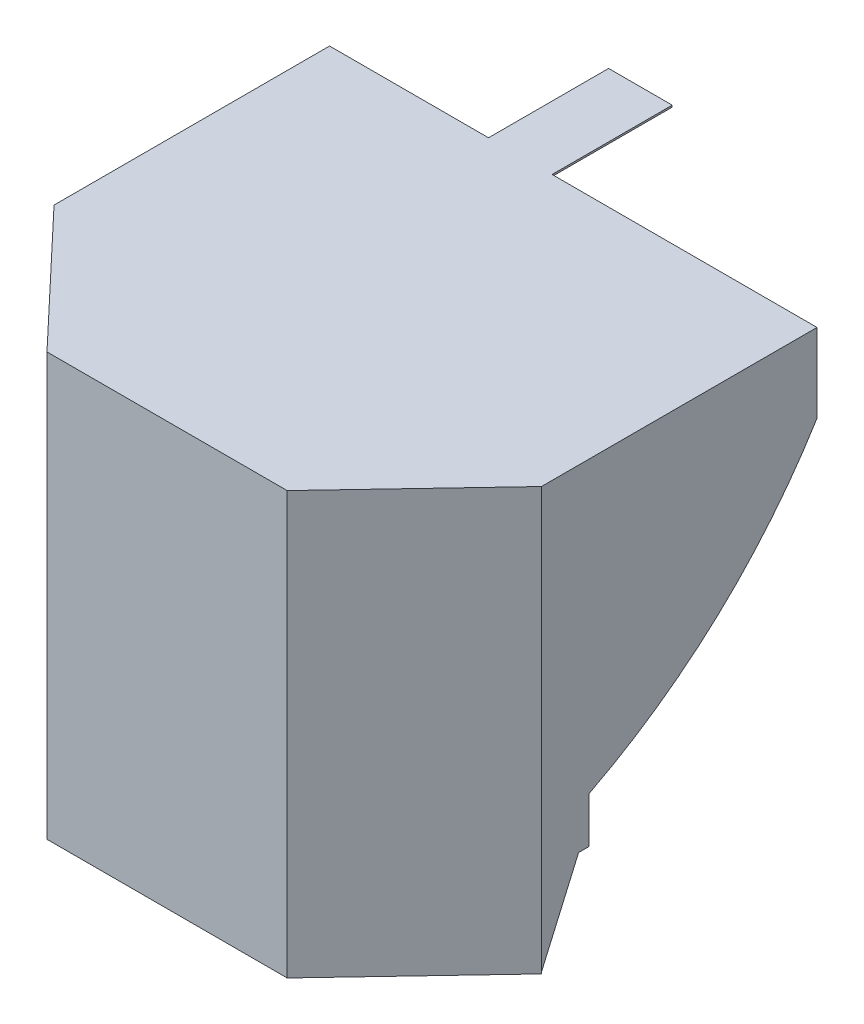
ISO-10303-21;
HEADER;
FILE_DESCRIPTION(('STEP AP214'),'2;1');
FILE_NAME('part.step','',(''),(''),'','','');
FILE_SCHEMA(('AUTOMOTIVE_DESIGN { 1 0 10303 214 1 1 1 1 }'));
ENDSEC;
DATA;
#1=APPLICATION_CONTEXT('core data for automotive mechanical design processes');
#2=APPLICATION_PROTOCOL_DEFINITION('international standard','automotive_design',2000,#1);
#3=PRODUCT_CONTEXT('',#1,'mechanical');
#4=PRODUCT('Part','Part','',(#3));
#5=PRODUCT_RELATED_PRODUCT_CATEGORY('part','',(#4));
#6=PRODUCT_DEFINITION_FORMATION('','',#4);
#7=PRODUCT_DEFINITION_CONTEXT('part definition',#1,'design');
#8=PRODUCT_DEFINITION('design','',#6,#7);
#9=PRODUCT_DEFINITION_SHAPE('','',#8);
#10=(LENGTH_UNIT() NAMED_UNIT(*) SI_UNIT(.MILLI.,.METRE.));
#11=(NAMED_UNIT(*) PLANE_ANGLE_UNIT() SI_UNIT($,.RADIAN.));
#12=(NAMED_UNIT(*) SI_UNIT($,.STERADIAN.) SOLID_ANGLE_UNIT());
#13=UNCERTAINTY_MEASURE_WITH_UNIT(LENGTH_MEASURE(1.E-05),#10,'distance_accuracy_value','');
#14=(GEOMETRIC_REPRESENTATION_CONTEXT(3) GLOBAL_UNCERTAINTY_ASSIGNED_CONTEXT((#13)) GLOBAL_UNIT_ASSIGNED_CONTEXT((#10,
#11,#12)) REPRESENTATION_CONTEXT('',''));
#15=CARTESIAN_POINT('',(0.,0.,0.));
#16=DIRECTION('',(0.,0.,1.));
#17=DIRECTION('',(1.,0.,0.));
#18=AXIS2_PLACEMENT_3D('',#15,#16,#17);
#19=CARTESIAN_POINT('',(276.,0.,-124.922861264772));
#20=DIRECTION('',(0.726468416954703,0.,0.687199853876096));
#21=DIRECTION('',(0.687199853876096,0.,-0.726468416954703));
#22=AXIS2_PLACEMENT_3D('',#19,#20,#21);
#23=PLANE('',#22);
#24=DIRECTION('',(0.,-1.,0.));
#25=VECTOR('',#24,1.);
#26=CARTESIAN_POINT('',(135.999999999882,0.,23.0771387348958));
#27=LINE('',#26,#25);
#28=CARTESIAN_POINT('',(135.999999999659,476.,23.077138734685));
#29=VERTEX_POINT('',#28);
#30=CARTESIAN_POINT('',(135.999999999882,-2.,23.0771387348958));
#31=VERTEX_POINT('',#30);
#32=EDGE_CURVE('E481',#29,#31,#27,.T.);
#33=ORIENTED_EDGE('',*,*,#32,.T.);
#34=DIRECTION('',(-0.687199853877257,0.,0.726468416953605));
#35=VECTOR('',#34,1.);
#36=CARTESIAN_POINT('',(135.999999999882,-2.,23.0771387348958));
#37=LINE('',#36,#35);
#38=CARTESIAN_POINT('',(276.000000000422,-2.,-124.922861265196));
#39=VERTEX_POINT('',#38);
#40=EDGE_CURVE('E451',#39,#31,#37,.T.);
#41=ORIENTED_EDGE('',*,*,#40,.F.);
#42=DIRECTION('',(0.,-1.,0.));
#43=VECTOR('',#42,1.);
#44=CARTESIAN_POINT('',(276.000000000422,0.,-124.922861265196));
#45=LINE('',#44,#43);
#46=CARTESIAN_POINT('',(276.000000000422,9.69753366541467E-10,-124.922861265196));
#47=VERTEX_POINT('',#46);
#48=EDGE_CURVE('E473',#47,#39,#45,.T.);
#49=ORIENTED_EDGE('',*,*,#48,.F.);
#50=CARTESIAN_POINT('',(276.,476.,-124.922861265196));
#51=VERTEX_POINT('',#50);
#52=EDGE_CURVE('E469',#51,#47,#45,.T.);
#53=ORIENTED_EDGE('',*,*,#52,.F.);
#54=DIRECTION('',(0.687199853877258,0.,-0.726468416953605));
#55=VECTOR('',#54,1.);
#56=CARTESIAN_POINT('',(276.,476.,-124.922861265196));
#57=LINE('',#56,#55);
#58=EDGE_CURVE('E262',#29,#51,#57,.T.);
#59=ORIENTED_EDGE('',*,*,#58,.F.);
#60=EDGE_LOOP('',(#33,#41,#49,#53,#59));
#61=FACE_BOUND('',#60,.T.);
#62=ADVANCED_FACE('F17',(#61),#23,.T.);
#63=CARTESIAN_POINT('',(-136.002670109606,0.,23.0771387348958));
#64=DIRECTION('',(-0.726468416953688,0.,0.687199853877169));
#65=DIRECTION('',(0.687199853877169,0.,0.726468416953688));
#66=AXIS2_PLACEMENT_3D('',#63,#64,#65);
#67=PLANE('',#66);
#68=DIRECTION('',(0.,-1.,0.));
#69=VECTOR('',#68,1.);
#70=CARTESIAN_POINT('',(-276.002670109606,0.,-124.922861264661));
#71=LINE('',#70,#69);
#72=CARTESIAN_POINT('',(-276.002670109721,476.,-124.922861264783));
#73=VERTEX_POINT('',#72);
#74=CARTESIAN_POINT('',(-276.002670109606,-2.,-124.922861264661));
#75=VERTEX_POINT('',#74);
#76=EDGE_CURVE('E237',#73,#75,#71,.T.);
#77=ORIENTED_EDGE('',*,*,#76,.T.);
#78=DIRECTION('',(-0.687199853877169,0.,-0.726468416953688));
#79=VECTOR('',#78,1.);
#80=CARTESIAN_POINT('',(-136.002670109606,-2.,23.0771387348958));
#81=LINE('',#80,#79);
#82=CARTESIAN_POINT('',(-136.002670109606,-2.,23.0771387348958));
#83=VERTEX_POINT('',#82);
#84=EDGE_CURVE('E464',#83,#75,#81,.T.);
#85=ORIENTED_EDGE('',*,*,#84,.F.);
#86=DIRECTION('',(0.,-1.,0.));
#87=VECTOR('',#86,1.);
#88=CARTESIAN_POINT('',(-136.002670109606,0.,23.0771387348958));
#89=LINE('',#88,#87);
#90=CARTESIAN_POINT('',(-136.002670109605,476.,23.077138734685));
#91=VERTEX_POINT('',#90);
#92=EDGE_CURVE('E239',#91,#83,#89,.T.);
#93=ORIENTED_EDGE('',*,*,#92,.F.);
#94=DIRECTION('',(0.687199853877685,0.,0.7264684169532));
#95=VECTOR('',#94,1.);
#96=CARTESIAN_POINT('',(-276.,476.,-124.920038577364));
#97=LINE('',#96,#95);
#98=EDGE_CURVE('E233',#73,#91,#97,.T.);
#99=ORIENTED_EDGE('',*,*,#98,.F.);
#100=EDGE_LOOP('',(#77,#85,#93,#99));
#101=FACE_BOUND('',#100,.T.);
#102=ADVANCED_FACE('F235',(#101),#67,.T.);
#103=CARTESIAN_POINT('',(-4.96942283656245,-2.,-303.536896852607));
#104=DIRECTION('',(0.,1.,0.));
#105=DIRECTION('',(0.,0.,1.));
#106=AXIS2_PLACEMENT_3D('',#103,#104,#105);
#107=PLANE('',#106);
#108=ORIENTED_EDGE('',*,*,#40,.T.);
#109=DIRECTION('',(-1.,0.,0.));
#110=VECTOR('',#109,1.);
#111=CARTESIAN_POINT('',(135.999999999882,-2.,23.0771387348958));
#112=LINE('',#111,#110);
#113=EDGE_CURVE('E455',#31,#83,#112,.T.);
#114=ORIENTED_EDGE('',*,*,#113,.T.);
#115=ORIENTED_EDGE('',*,*,#84,.T.);
#116=DIRECTION('',(1.,0.,0.));
#117=VECTOR('',#116,1.);
#118=CARTESIAN_POINT('',(-276.002670109606,-2.,-124.922861264661));
#119=LINE('',#118,#117);
#120=CARTESIAN_POINT('',(-246.002670109606,-2.,-124.922861264661));
#121=VERTEX_POINT('',#120);
#122=EDGE_CURVE('E254',#75,#121,#119,.T.);
#123=ORIENTED_EDGE('',*,*,#122,.T.);
#124=CARTESIAN_POINT('',(-4.96942283656245,-2.,-303.536896852607));
#125=DIRECTION('',(0.,1.,0.));
#126=DIRECTION('',(1.,0.,0.));
#127=AXIS2_PLACEMENT_3D('',#124,#125,#126);
#128=CIRCLE('',#127,300.);
#129=CARTESIAN_POINT('',(-150.000000000121,-2.,-40.9228612650071));
#130=VERTEX_POINT('',#129);
#131=EDGE_CURVE('E696',#121,#130,#128,.T.);
#132=ORIENTED_EDGE('',*,*,#131,.T.);
#133=DIRECTION('',(1.,0.,0.));
#134=VECTOR('',#133,1.);
#135=CARTESIAN_POINT('',(-150.000000000121,-2.,-40.9228612650071));
#136=LINE('',#135,#134);
#137=CARTESIAN_POINT('',(149.999999999317,-2.,-40.9228612650071));
#138=VERTEX_POINT('',#137);
#139=EDGE_CURVE('E700',#130,#138,#136,.T.);
#140=ORIENTED_EDGE('',*,*,#139,.T.);
#141=CARTESIAN_POINT('',(4.96490300414403,-2.,-303.53440069083));
#142=DIRECTION('',(0.,1.,0.));
#143=DIRECTION('',(1.,0.,0.));
#144=AXIS2_PLACEMENT_3D('',#141,#142,#143);
#145=CIRCLE('',#144,300.);
#146=CARTESIAN_POINT('',(246.000000000421,-2.,-124.922861265196));
#147=VERTEX_POINT('',#146);
#148=EDGE_CURVE('E703',#138,#147,#145,.T.);
#149=ORIENTED_EDGE('',*,*,#148,.T.);
#150=DIRECTION('',(1.,0.,0.));
#151=VECTOR('',#150,1.);
#152=CARTESIAN_POINT('',(246.000000000421,-2.,-124.922861265196));
#153=LINE('',#152,#151);
#154=EDGE_CURVE('E273',#147,#39,#153,.T.);
#155=ORIENTED_EDGE('',*,*,#154,.T.);
#156=EDGE_LOOP('',(#108,#114,#115,#123,#132,#140,#149,#155));
#157=FACE_BOUND('',#156,.T.);
#158=ADVANCED_FACE('F562',(#157),#107,.F.);
#159=CARTESIAN_POINT('',(-276.,0.,-436.922861264772));
#160=DIRECTION('',(0.,0.,1.));
#161=DIRECTION('',(0.,1.,0.));
#162=AXIS2_PLACEMENT_3D('',#159,#160,#161);
#163=PLANE('',#162);
#164=DIRECTION('',(1.,0.,0.));
#165=VECTOR('',#164,1.);
#166=CARTESIAN_POINT('',(-876.,387.,-436.922861264772));
#167=LINE('',#166,#165);
#168=CARTESIAN_POINT('',(-276.,387.,-436.922861264772));
#169=VERTEX_POINT('',#168);
#170=CARTESIAN_POINT('',(-274.,387.,-436.922861264772));
#171=VERTEX_POINT('',#170);
#172=EDGE_CURVE('E637',#169,#171,#167,.T.);
#173=ORIENTED_EDGE('',*,*,#172,.F.);
#174=DIRECTION('',(0.,1.,0.));
#175=VECTOR('',#174,1.);
#176=CARTESIAN_POINT('',(-276.,0.,-436.922861264772));
#177=LINE('',#176,#175);
#178=CARTESIAN_POINT('',(-276.,476.,-436.922861264772));
#179=VERTEX_POINT('',#178);
#180=EDGE_CURVE('E376',#169,#179,#177,.T.);
#181=ORIENTED_EDGE('',*,*,#180,.T.);
#182=DIRECTION('',(-1.,0.,0.));
#183=VECTOR('',#182,1.);
#184=CARTESIAN_POINT('',(-276.,476.,-436.922861264772));
#185=LINE('',#184,#183);
#186=CARTESIAN_POINT('',(-96.,476.,-436.922861264772));
#187=VERTEX_POINT('',#186);
#188=EDGE_CURVE('E437',#187,#179,#185,.T.);
#189=ORIENTED_EDGE('',*,*,#188,.F.);
#190=DIRECTION('',(0.,1.,0.));
#191=VECTOR('',#190,1.);
#192=CARTESIAN_POINT('',(-96.,474.,-436.922861264772));
#193=LINE('',#192,#191);
#194=CARTESIAN_POINT('',(-96.,474.,-436.922861264772));
#195=VERTEX_POINT('',#194);
#196=EDGE_CURVE('E401',#195,#187,#193,.T.);
#197=ORIENTED_EDGE('',*,*,#196,.F.);
#198=DIRECTION('',(-1.,0.,0.));
#199=VECTOR('',#198,1.);
#200=CARTESIAN_POINT('',(-276.,474.,-436.922861264772));
#201=LINE('',#200,#199);
#202=CARTESIAN_POINT('',(-274.,474.,-436.922861264772));
#203=VERTEX_POINT('',#202);
#204=EDGE_CURVE('E397',#195,#203,#201,.T.);
#205=ORIENTED_EDGE('',*,*,#204,.T.);
#206=DIRECTION('',(0.,1.,0.));
#207=VECTOR('',#206,1.);
#208=CARTESIAN_POINT('',(-274.,0.,-436.922861264772));
#209=LINE('',#208,#207);
#210=EDGE_CURVE('E338',#171,#203,#209,.T.);
#211=ORIENTED_EDGE('',*,*,#210,.F.);
#212=EDGE_LOOP('',(#173,#181,#189,#197,#205,#211));
#213=FACE_BOUND('',#212,.T.);
#214=ADVANCED_FACE('F399',(#213),#163,.F.);
#215=CARTESIAN_POINT('',(276.,0.,-436.922861264771));
#216=DIRECTION('',(0.,0.,-1.));
#217=DIRECTION('',(0.,1.,0.));
#218=AXIS2_PLACEMENT_3D('',#215,#216,#217);
#219=PLANE('',#218);
#220=CARTESIAN_POINT('',(274.,387.,-436.922861264771));
#221=VERTEX_POINT('',#220);
#222=CARTESIAN_POINT('',(276.,387.,-436.922861264771));
#223=VERTEX_POINT('',#222);
#224=EDGE_CURVE('E499',#221,#223,#167,.T.);
#225=ORIENTED_EDGE('',*,*,#224,.F.);
#226=DIRECTION('',(0.,1.,0.));
#227=VECTOR('',#226,1.);
#228=CARTESIAN_POINT('',(274.,0.,-436.922861264771));
#229=LINE('',#228,#227);
#230=CARTESIAN_POINT('',(274.,474.,-436.922861264771));
#231=VERTEX_POINT('',#230);
#232=EDGE_CURVE('E357',#221,#231,#229,.T.);
#233=ORIENTED_EDGE('',*,*,#232,.T.);
#234=DIRECTION('',(-1.,0.,0.));
#235=VECTOR('',#234,1.);
#236=CARTESIAN_POINT('',(-24.0000000000053,474.,-436.922861264772));
#237=LINE('',#236,#235);
#238=CARTESIAN_POINT('',(-24.0000000000053,474.,-436.922861264772));
#239=VERTEX_POINT('',#238);
#240=EDGE_CURVE('E413',#231,#239,#237,.T.);
#241=ORIENTED_EDGE('',*,*,#240,.T.);
#242=DIRECTION('',(0.,1.,0.));
#243=VECTOR('',#242,1.);
#244=CARTESIAN_POINT('',(-24.0000000000053,474.,-436.922861264772));
#245=LINE('',#244,#243);
#246=CARTESIAN_POINT('',(-24.0000000000053,476.,-436.922861264772));
#247=VERTEX_POINT('',#246);
#248=EDGE_CURVE('E411',#239,#247,#245,.T.);
#249=ORIENTED_EDGE('',*,*,#248,.T.);
#250=DIRECTION('',(-1.,0.,0.));
#251=VECTOR('',#250,1.);
#252=CARTESIAN_POINT('',(-24.0000000000053,476.,-436.922861264772));
#253=LINE('',#252,#251);
#254=CARTESIAN_POINT('',(276.,476.,-436.922861264772));
#255=VERTEX_POINT('',#254);
#256=EDGE_CURVE('E421',#255,#247,#253,.T.);
#257=ORIENTED_EDGE('',*,*,#256,.F.);
#258=DIRECTION('',(0.,1.,0.));
#259=VECTOR('',#258,1.);
#260=CARTESIAN_POINT('',(276.,0.,-436.922861264771));
#261=LINE('',#260,#259);
#262=EDGE_CURVE('E343',#223,#255,#261,.T.);
#263=ORIENTED_EDGE('',*,*,#262,.F.);
#264=EDGE_LOOP('',(#225,#233,#241,#249,#257,#263));
#265=FACE_BOUND('',#264,.T.);
#266=ADVANCED_FACE('F19',(#265),#219,.T.);
#267=CARTESIAN_POINT('',(274.,0.,-124.922861264772));
#268=DIRECTION('',(1.,0.,0.));
#269=DIRECTION('',(0.,0.,-1.));
#270=AXIS2_PLACEMENT_3D('',#267,#268,#269);
#271=PLANE('',#270);
#272=DIRECTION('',(0.,0.,-1.));
#273=VECTOR('',#272,1.);
#274=CARTESIAN_POINT('',(274.,474.,-124.922861264772));
#275=LINE('',#274,#273);
#276=CARTESIAN_POINT('',(274.,474.,-125.719733129875));
#277=VERTEX_POINT('',#276);
#278=EDGE_CURVE('E361',#277,#231,#275,.T.);
#279=ORIENTED_EDGE('',*,*,#278,.T.);
#280=ORIENTED_EDGE('',*,*,#232,.F.);
#281=CARTESIAN_POINT('',(274.,726.561368596782,117.331662358338));
#282=DIRECTION('',(1.,0.,0.));
#283=DIRECTION('',(0.,0.,-1.));
#284=AXIS2_PLACEMENT_3D('',#281,#282,#283);
#285=CIRCLE('',#284,650.);
#286=CARTESIAN_POINT('',(274.,148.,-178.922861265215));
#287=VERTEX_POINT('',#286);
#288=EDGE_CURVE('E378',#221,#287,#285,.F.);
#289=ORIENTED_EDGE('',*,*,#288,.T.);
#290=DIRECTION('',(0.,-1.,0.));
#291=VECTOR('',#290,1.);
#292=CARTESIAN_POINT('',(274.,0.,-178.922861265215));
#293=LINE('',#292,#291);
#294=CARTESIAN_POINT('',(274.,96.,-178.922861265215));
#295=VERTEX_POINT('',#294);
#296=EDGE_CURVE('E610',#287,#295,#293,.T.);
#297=ORIENTED_EDGE('',*,*,#296,.T.);
#298=DIRECTION('',(0.,0.,1.));
#299=VECTOR('',#298,1.);
#300=CARTESIAN_POINT('',(274.,96.,-124.922861264772));
#301=LINE('',#300,#299);
#302=CARTESIAN_POINT('',(274.,96.,-166.922861265215));
#303=VERTEX_POINT('',#302);
#304=EDGE_CURVE('E619',#295,#303,#301,.T.);
#305=ORIENTED_EDGE('',*,*,#304,.T.);
#306=DIRECTION('',(0.,-0.916157334900635,0.40081883402326));
#307=VECTOR('',#306,1.);
#308=CARTESIAN_POINT('',(274.,0.,-124.922861264772));
#309=LINE('',#308,#307);
#310=CARTESIAN_POINT('',(274.,1.82142140593046,-125.719733129875));
#311=VERTEX_POINT('',#310);
#312=EDGE_CURVE('E506',#303,#311,#309,.T.);
#313=ORIENTED_EDGE('',*,*,#312,.T.);
#314=DIRECTION('',(0.,1.,0.));
#315=VECTOR('',#314,1.);
#316=CARTESIAN_POINT('',(274.,0.,-125.719733129875));
#317=LINE('',#316,#315);
#318=EDGE_CURVE('E327',#311,#277,#317,.T.);
#319=ORIENTED_EDGE('',*,*,#318,.T.);
#320=EDGE_LOOP('',(#279,#280,#289,#297,#305,#313,#319));
#321=FACE_BOUND('',#320,.T.);
#322=ADVANCED_FACE('F502',(#321),#271,.F.);
#323=CARTESIAN_POINT('',(273.998,0.,-125.719733129875));
#324=DIRECTION('',(0.,1.,0.));
#325=DIRECTION('',(0.,0.,1.));
#326=AXIS2_PLACEMENT_3D('',#323,#324,#325);
#327=CYLINDRICAL_SURFACE('',#326,0.00199999999999983);
#328=ORIENTED_EDGE('',*,*,#318,.F.);
#329=CARTESIAN_POINT('',(273.998,1.82142140593046,-125.719733129875));
#330=DIRECTION('',(0.,0.40081883402326,0.916157334900635));
#331=DIRECTION('',(0.,0.916157334900635,-0.40081883402326));
#332=AXIS2_PLACEMENT_3D('',#329,#330,#331);
#333=ELLIPSE('',#332,0.00498978548469049,0.00199999999999983);
#334=CARTESIAN_POINT('',(273.999452936834,1.81827992088415,-125.718358730167));
#335=VERTEX_POINT('',#334);
#336=EDGE_CURVE('E627',#311,#335,#333,.F.);
#337=ORIENTED_EDGE('',*,*,#336,.T.);
#338=DIRECTION('',(0.,1.,0.));
#339=VECTOR('',#338,1.);
#340=CARTESIAN_POINT('',(273.999452936834,0.,-125.718358730167));
#341=LINE('',#340,#339);
#342=CARTESIAN_POINT('',(273.999452936834,474.,-125.718358730167));
#343=VERTEX_POINT('',#342);
#344=EDGE_CURVE('E328',#335,#343,#341,.T.);
#345=ORIENTED_EDGE('',*,*,#344,.T.);
#346=CARTESIAN_POINT('',(273.998,474.,-125.719733129875));
#347=DIRECTION('',(0.,1.,0.));
#348=DIRECTION('',(0.,0.,1.));
#349=AXIS2_PLACEMENT_3D('',#346,#347,#348);
#350=CIRCLE('',#349,0.00199999999999983);
#351=EDGE_CURVE('E323',#343,#277,#350,.T.);
#352=ORIENTED_EDGE('',*,*,#351,.T.);
#353=EDGE_LOOP('',(#328,#337,#345,#352));
#354=FACE_BOUND('',#353,.T.);
#355=ADVANCED_FACE('F512',(#354),#327,.F.);
#356=CARTESIAN_POINT('',(274.547063166091,0.,-126.297260972524));
#357=DIRECTION('',(0.726468416954703,0.,0.687199853876096));
#358=DIRECTION('',(0.687199853876096,0.,-0.726468416954703));
#359=AXIS2_PLACEMENT_3D('',#356,#357,#358);
#360=PLANE('',#359);
#361=DIRECTION('',(-0.354525571380812,-0.856649543898845,0.374784175459702));
#362=VECTOR('',#361,1.);
#363=CARTESIAN_POINT('',(273.592981060616,0.836111142441613,-125.288659889594));
#364=LINE('',#363,#362);
#365=CARTESIAN_POINT('',(273.246955334835,0.,-124.922861265196));
#366=VERTEX_POINT('',#365);
#367=EDGE_CURVE('E370',#335,#366,#364,.T.);
#368=ORIENTED_EDGE('',*,*,#367,.T.);
#369=DIRECTION('',(0.687199853876096,0.,-0.726468416954703));
#370=VECTOR('',#369,1.);
#371=CARTESIAN_POINT('',(274.547063166091,0.,-126.297260972524));
#372=LINE('',#371,#370);
#373=CARTESIAN_POINT('',(135.13943901038,0.,21.0765131349361));
#374=VERTEX_POINT('',#373);
#375=EDGE_CURVE('E332',#374,#366,#372,.T.);
#376=ORIENTED_EDGE('',*,*,#375,.F.);
#377=DIRECTION('',(0.,1.,0.));
#378=VECTOR('',#377,1.);
#379=CARTESIAN_POINT('',(135.13943901038,0.,21.0765131349361));
#380=LINE('',#379,#378);
#381=CARTESIAN_POINT('',(135.13943901038,474.,21.0765131349361));
#382=VERTEX_POINT('',#381);
#383=EDGE_CURVE('E333',#374,#382,#380,.T.);
#384=ORIENTED_EDGE('',*,*,#383,.T.);
#385=DIRECTION('',(0.687199853876096,0.,-0.726468416954703));
#386=VECTOR('',#385,1.);
#387=CARTESIAN_POINT('',(274.547063166091,474.,-126.297260972524));
#388=LINE('',#387,#386);
#389=EDGE_CURVE('E329',#382,#343,#388,.T.);
#390=ORIENTED_EDGE('',*,*,#389,.T.);
#391=ORIENTED_EDGE('',*,*,#344,.F.);
#392=EDGE_LOOP('',(#368,#376,#384,#390,#391));
#393=FACE_BOUND('',#392,.T.);
#394=ADVANCED_FACE('F520',(#393),#360,.F.);
#395=CARTESIAN_POINT('',(135.137986073546,0.,21.0751387352284));
#396=DIRECTION('',(0.,1.,0.));
#397=DIRECTION('',(0.,0.,1.));
#398=AXIS2_PLACEMENT_3D('',#395,#396,#397);
#399=CYLINDRICAL_SURFACE('',#398,0.00199999999999983);
#400=CARTESIAN_POINT('',(135.137986073546,474.,21.0751387352284));
#401=DIRECTION('',(0.,1.,0.));
#402=DIRECTION('',(0.,0.,1.));
#403=AXIS2_PLACEMENT_3D('',#400,#401,#402);
#404=CIRCLE('',#403,0.00199999999999983);
#405=CARTESIAN_POINT('',(135.137986073546,474.,21.0771387352283));
#406=VERTEX_POINT('',#405);
#407=EDGE_CURVE('E334',#406,#382,#404,.T.);
#408=ORIENTED_EDGE('',*,*,#407,.T.);
#409=ORIENTED_EDGE('',*,*,#383,.F.);
#410=CARTESIAN_POINT('',(135.137986073546,0.,21.0751387352284));
#411=DIRECTION('',(0.,1.,0.));
#412=DIRECTION('',(0.,0.,1.));
#413=AXIS2_PLACEMENT_3D('',#410,#411,#412);
#414=CIRCLE('',#413,0.00199999999999983);
#415=CARTESIAN_POINT('',(135.137986073546,0.,21.0771387352284));
#416=VERTEX_POINT('',#415);
#417=EDGE_CURVE('E337',#416,#374,#414,.T.);
#418=ORIENTED_EDGE('',*,*,#417,.F.);
#419=DIRECTION('',(0.,1.,0.));
#420=VECTOR('',#419,1.);
#421=CARTESIAN_POINT('',(135.137986073546,0.,21.0771387352284));
#422=LINE('',#421,#420);
#423=EDGE_CURVE('E346',#416,#406,#422,.T.);
#424=ORIENTED_EDGE('',*,*,#423,.T.);
#425=EDGE_LOOP('',(#408,#409,#418,#424));
#426=FACE_BOUND('',#425,.T.);
#427=ADVANCED_FACE('F545',(#426),#399,.F.);
#428=CARTESIAN_POINT('',(-274.,0.,-124.922861264772));
#429=DIRECTION('',(-1.,0.,0.));
#430=DIRECTION('',(0.,0.,1.));
#431=AXIS2_PLACEMENT_3D('',#428,#429,#430);
#432=PLANE('',#431);
#433=DIRECTION('',(0.,0.,1.));
#434=VECTOR('',#433,1.);
#435=CARTESIAN_POINT('',(-274.,474.,-124.922861264772));
#436=LINE('',#435,#434);
#437=CARTESIAN_POINT('',(-274.,474.,-125.719733129876));
#438=VERTEX_POINT('',#437);
#439=EDGE_CURVE('E322',#203,#438,#436,.T.);
#440=ORIENTED_EDGE('',*,*,#439,.T.);
#441=DIRECTION('',(0.,1.,0.));
#442=VECTOR('',#441,1.);
#443=CARTESIAN_POINT('',(-274.,0.,-125.719733129876));
#444=LINE('',#443,#442);
#445=CARTESIAN_POINT('',(-274.,1.8214214059341,-125.719733129876));
#446=VERTEX_POINT('',#445);
#447=EDGE_CURVE('E306',#446,#438,#444,.T.);
#448=ORIENTED_EDGE('',*,*,#447,.F.);
#449=DIRECTION('',(0.,0.916157334900635,-0.40081883402326));
#450=VECTOR('',#449,1.);
#451=CARTESIAN_POINT('',(-274.,0.,-124.922861264772));
#452=LINE('',#451,#450);
#453=CARTESIAN_POINT('',(-274.,96.,-166.922861265215));
#454=VERTEX_POINT('',#453);
#455=EDGE_CURVE('E629',#446,#454,#452,.T.);
#456=ORIENTED_EDGE('',*,*,#455,.T.);
#457=DIRECTION('',(0.,0.,-1.));
#458=VECTOR('',#457,1.);
#459=CARTESIAN_POINT('',(-274.,96.,-124.922861264772));
#460=LINE('',#459,#458);
#461=CARTESIAN_POINT('',(-274.,96.,-178.922861265216));
#462=VERTEX_POINT('',#461);
#463=EDGE_CURVE('E621',#454,#462,#460,.T.);
#464=ORIENTED_EDGE('',*,*,#463,.T.);
#465=DIRECTION('',(0.,1.,0.));
#466=VECTOR('',#465,1.);
#467=CARTESIAN_POINT('',(-274.,0.,-178.922861265216));
#468=LINE('',#467,#466);
#469=CARTESIAN_POINT('',(-274.,148.,-178.922861265215));
#470=VERTEX_POINT('',#469);
#471=EDGE_CURVE('E613',#462,#470,#468,.T.);
#472=ORIENTED_EDGE('',*,*,#471,.T.);
#473=CARTESIAN_POINT('',(-274.,726.561368596782,117.331662358338));
#474=DIRECTION('',(-1.,0.,0.));
#475=DIRECTION('',(0.,0.,1.));
#476=AXIS2_PLACEMENT_3D('',#473,#474,#475);
#477=CIRCLE('',#476,650.);
#478=EDGE_CURVE('E387',#470,#171,#477,.F.);
#479=ORIENTED_EDGE('',*,*,#478,.T.);
#480=ORIENTED_EDGE('',*,*,#210,.T.);
#481=EDGE_LOOP('',(#440,#448,#456,#464,#472,#479,#480));
#482=FACE_BOUND('',#481,.T.);
#483=ADVANCED_FACE('F384',(#482),#432,.F.);
#484=CARTESIAN_POINT('',(-273.998,0.,-125.719733129876));
#485=DIRECTION('',(0.,1.,0.));
#486=DIRECTION('',(0.,0.,1.));
#487=AXIS2_PLACEMENT_3D('',#484,#485,#486);
#488=CYLINDRICAL_SURFACE('',#487,0.00199999999999983);
#489=DIRECTION('',(0.,1.,0.));
#490=VECTOR('',#489,1.);
#491=CARTESIAN_POINT('',(-273.999452936834,0.,-125.718358730169));
#492=LINE('',#491,#490);
#493=CARTESIAN_POINT('',(-273.999452936834,1.81827992088781,-125.718358730169));
#494=VERTEX_POINT('',#493);
#495=CARTESIAN_POINT('',(-273.999452936834,474.,-125.718358730169));
#496=VERTEX_POINT('',#495);
#497=EDGE_CURVE('E294',#494,#496,#492,.T.);
#498=ORIENTED_EDGE('',*,*,#497,.F.);
#499=CARTESIAN_POINT('',(-273.998,1.8214214059341,-125.719733129876));
#500=DIRECTION('',(0.,0.40081883402326,0.916157334900635));
#501=DIRECTION('',(0.,0.916157334900635,-0.40081883402326));
#502=AXIS2_PLACEMENT_3D('',#499,#500,#501);
#503=ELLIPSE('',#502,0.00498978548469049,0.00199999999999983);
#504=EDGE_CURVE('E631',#494,#446,#503,.F.);
#505=ORIENTED_EDGE('',*,*,#504,.T.);
#506=ORIENTED_EDGE('',*,*,#447,.T.);
#507=CARTESIAN_POINT('',(-273.998,474.,-125.719733129876));
#508=DIRECTION('',(0.,1.,0.));
#509=DIRECTION('',(0.,0.,1.));
#510=AXIS2_PLACEMENT_3D('',#507,#508,#509);
#511=CIRCLE('',#510,0.00199999999999983);
#512=EDGE_CURVE('E293',#438,#496,#511,.T.);
#513=ORIENTED_EDGE('',*,*,#512,.T.);
#514=EDGE_LOOP('',(#498,#505,#506,#513));
#515=FACE_BOUND('',#514,.T.);
#516=ADVANCED_FACE('F553',(#515),#488,.F.);
#517=CARTESIAN_POINT('',(-274.547063166092,0.,-126.297260972526));
#518=DIRECTION('',(-0.726468416953708,0.,0.687199853877148));
#519=DIRECTION('',(0.687199853877148,0.,0.726468416953708));
#520=AXIS2_PLACEMENT_3D('',#517,#518,#519);
#521=PLANE('',#520);
#522=DIRECTION('',(0.,1.,0.));
#523=VECTOR('',#522,1.);
#524=CARTESIAN_POINT('',(-135.139439009975,0.,21.0765131349362));
#525=LINE('',#524,#523);
#526=CARTESIAN_POINT('',(-135.139439009975,0.,21.0765131349362));
#527=VERTEX_POINT('',#526);
#528=CARTESIAN_POINT('',(-135.139439009975,474.,21.0765131349363));
#529=VERTEX_POINT('',#528);
#530=EDGE_CURVE('E318',#527,#529,#525,.T.);
#531=ORIENTED_EDGE('',*,*,#530,.F.);
#532=DIRECTION('',(0.687199853877148,0.,0.726468416953708));
#533=VECTOR('',#532,1.);
#534=CARTESIAN_POINT('',(-274.547063166092,0.,-126.297260972526));
#535=LINE('',#534,#533);
#536=CARTESIAN_POINT('',(-273.246955334429,0.,-124.922861264772));
#537=VERTEX_POINT('',#536);
#538=EDGE_CURVE('E291',#537,#527,#535,.T.);
#539=ORIENTED_EDGE('',*,*,#538,.F.);
#540=DIRECTION('',(-0.354525571381712,0.856649543898533,-0.374784175459565));
#541=VECTOR('',#540,1.);
#542=CARTESIAN_POINT('',(-273.592981060615,0.836111142444519,-125.288659889595));
#543=LINE('',#542,#541);
#544=EDGE_CURVE('E634',#537,#494,#543,.T.);
#545=ORIENTED_EDGE('',*,*,#544,.T.);
#546=ORIENTED_EDGE('',*,*,#497,.T.);
#547=DIRECTION('',(0.687199853877148,0.,0.726468416953708));
#548=VECTOR('',#547,1.);
#549=CARTESIAN_POINT('',(-274.547063166092,474.,-126.297260972526));
#550=LINE('',#549,#548);
#551=EDGE_CURVE('E308',#496,#529,#550,.T.);
#552=ORIENTED_EDGE('',*,*,#551,.T.);
#553=EDGE_LOOP('',(#531,#539,#545,#546,#552));
#554=FACE_BOUND('',#553,.T.);
#555=ADVANCED_FACE('F582',(#554),#521,.F.);
#556=CARTESIAN_POINT('',(-135.137986073141,0.,21.0751387352284));
#557=DIRECTION('',(0.,1.,0.));
#558=DIRECTION('',(0.,0.,1.));
#559=AXIS2_PLACEMENT_3D('',#556,#557,#558);
#560=CYLINDRICAL_SURFACE('',#559,0.00199999999999983);
#561=CARTESIAN_POINT('',(-135.137986073141,474.,21.0751387352284));
#562=DIRECTION('',(0.,1.,0.));
#563=DIRECTION('',(0.,0.,1.));
#564=AXIS2_PLACEMENT_3D('',#561,#562,#563);
#565=CIRCLE('',#564,0.00199999999999983);
#566=CARTESIAN_POINT('',(-135.137986073141,474.,21.0771387352284));
#567=VERTEX_POINT('',#566);
#568=EDGE_CURVE('E344',#529,#567,#565,.T.);
#569=ORIENTED_EDGE('',*,*,#568,.T.);
#570=DIRECTION('',(0.,1.,0.));
#571=VECTOR('',#570,1.);
#572=CARTESIAN_POINT('',(-135.137986073141,0.,21.0771387352284));
#573=LINE('',#572,#571);
#574=CARTESIAN_POINT('',(-135.137986073141,0.,21.0771387352284));
#575=VERTEX_POINT('',#574);
#576=EDGE_CURVE('E342',#575,#567,#573,.T.);
#577=ORIENTED_EDGE('',*,*,#576,.F.);
#578=CARTESIAN_POINT('',(-135.137986073141,0.,21.0751387352284));
#579=DIRECTION('',(0.,1.,0.));
#580=DIRECTION('',(0.,0.,1.));
#581=AXIS2_PLACEMENT_3D('',#578,#579,#580);
#582=CIRCLE('',#581,0.00199999999999983);
#583=EDGE_CURVE('E314',#527,#575,#582,.T.);
#584=ORIENTED_EDGE('',*,*,#583,.F.);
#585=ORIENTED_EDGE('',*,*,#530,.T.);
#586=EDGE_LOOP('',(#569,#577,#584,#585));
#587=FACE_BOUND('',#586,.T.);
#588=ADVANCED_FACE('F541',(#587),#560,.F.);
#589=CARTESIAN_POINT('',(135.999999999995,0.,21.0771387352283));
#590=DIRECTION('',(0.,0.,1.));
#591=DIRECTION('',(1.,0.,0.));
#592=AXIS2_PLACEMENT_3D('',#589,#590,#591);
#593=PLANE('',#592);
#594=DIRECTION('',(1.,0.,0.));
#595=VECTOR('',#594,1.);
#596=CARTESIAN_POINT('',(135.999999999995,474.,21.0771387352283));
#597=LINE('',#596,#595);
#598=EDGE_CURVE('E339',#567,#406,#597,.T.);
#599=ORIENTED_EDGE('',*,*,#598,.T.);
#600=ORIENTED_EDGE('',*,*,#423,.F.);
#601=DIRECTION('',(1.,0.,0.));
#602=VECTOR('',#601,1.);
#603=CARTESIAN_POINT('',(135.999999999995,0.,21.0771387352283));
#604=LINE('',#603,#602);
#605=EDGE_CURVE('E529',#575,#416,#604,.T.);
#606=ORIENTED_EDGE('',*,*,#605,.F.);
#607=ORIENTED_EDGE('',*,*,#576,.T.);
#608=EDGE_LOOP('',(#599,#600,#606,#607));
#609=FACE_BOUND('',#608,.T.);
#610=ADVANCED_FACE('F539',(#609),#593,.F.);
#611=CARTESIAN_POINT('',(276.,0.,-124.922861264772));
#612=DIRECTION('',(1.,0.,0.));
#613=DIRECTION('',(0.,0.,-1.));
#614=AXIS2_PLACEMENT_3D('',#611,#612,#613);
#615=PLANE('',#614);
#616=ORIENTED_EDGE('',*,*,#52,.T.);
#617=DIRECTION('',(0.,-0.916157334900635,0.40081883402326));
#618=VECTOR('',#617,1.);
#619=CARTESIAN_POINT('',(276.,0.,-124.922861264772));
#620=LINE('',#619,#618);
#621=CARTESIAN_POINT('',(276.,96.,-166.922861265215));
#622=VERTEX_POINT('',#621);
#623=EDGE_CURVE('E34',#622,#47,#620,.T.);
#624=ORIENTED_EDGE('',*,*,#623,.F.);
#625=DIRECTION('',(0.,0.,1.));
#626=VECTOR('',#625,1.);
#627=CARTESIAN_POINT('',(276.,96.,-124.922861264772));
#628=LINE('',#627,#626);
#629=CARTESIAN_POINT('',(276.,96.,-178.922861265215));
#630=VERTEX_POINT('',#629);
#631=EDGE_CURVE('E624',#630,#622,#628,.T.);
#632=ORIENTED_EDGE('',*,*,#631,.F.);
#633=DIRECTION('',(0.,-1.,0.));
#634=VECTOR('',#633,1.);
#635=CARTESIAN_POINT('',(276.,0.,-178.922861265215));
#636=LINE('',#635,#634);
#637=CARTESIAN_POINT('',(276.,148.,-178.922861265215));
#638=VERTEX_POINT('',#637);
#639=EDGE_CURVE('E606',#638,#630,#636,.T.);
#640=ORIENTED_EDGE('',*,*,#639,.F.);
#641=CARTESIAN_POINT('',(276.,726.561368596782,117.331662358338));
#642=DIRECTION('',(1.,0.,0.));
#643=DIRECTION('',(0.,0.,-1.));
#644=AXIS2_PLACEMENT_3D('',#641,#642,#643);
#645=CIRCLE('',#644,650.);
#646=EDGE_CURVE('E604',#223,#638,#645,.F.);
#647=ORIENTED_EDGE('',*,*,#646,.F.);
#648=ORIENTED_EDGE('',*,*,#262,.T.);
#649=DIRECTION('',(0.,0.,-1.));
#650=VECTOR('',#649,1.);
#651=CARTESIAN_POINT('',(276.,476.,-124.922861265196));
#652=LINE('',#651,#650);
#653=EDGE_CURVE('E418',#51,#255,#652,.T.);
#654=ORIENTED_EDGE('',*,*,#653,.F.);
#655=EDGE_LOOP('',(#616,#624,#632,#640,#647,#648,#654));
#656=FACE_BOUND('',#655,.T.);
#657=ADVANCED_FACE('F568',(#656),#615,.T.);
#658=CARTESIAN_POINT('',(-276.,0.,-124.922861264772));
#659=DIRECTION('',(-1.,0.,0.));
#660=DIRECTION('',(0.,0.,1.));
#661=AXIS2_PLACEMENT_3D('',#658,#659,#660);
#662=PLANE('',#661);
#663=DIRECTION('',(0.,0.,-1.));
#664=VECTOR('',#663,1.);
#665=CARTESIAN_POINT('',(-276.,96.,-124.922861264772));
#666=LINE('',#665,#664);
#667=CARTESIAN_POINT('',(-276.,96.,-166.922861265215));
#668=VERTEX_POINT('',#667);
#669=CARTESIAN_POINT('',(-276.,96.,-178.922861265216));
#670=VERTEX_POINT('',#669);
#671=EDGE_CURVE('E360',#668,#670,#666,.T.);
#672=ORIENTED_EDGE('',*,*,#671,.F.);
#673=DIRECTION('',(0.,0.916157334900635,-0.40081883402326));
#674=VECTOR('',#673,1.);
#675=CARTESIAN_POINT('',(-276.,0.,-124.922861264772));
#676=LINE('',#675,#674);
#677=CARTESIAN_POINT('',(-276.,-2.52964316160842E-10,-124.922861264661));
#678=VERTEX_POINT('',#677);
#679=EDGE_CURVE('E42',#678,#668,#676,.T.);
#680=ORIENTED_EDGE('',*,*,#679,.F.);
#681=DIRECTION('',(0.,-1.,0.));
#682=VECTOR('',#681,1.);
#683=CARTESIAN_POINT('',(-276.,0.,-124.922861264783));
#684=LINE('',#683,#682);
#685=CARTESIAN_POINT('',(-276.,476.,-124.922861264783));
#686=VERTEX_POINT('',#685);
#687=EDGE_CURVE('E260',#686,#678,#684,.T.);
#688=ORIENTED_EDGE('',*,*,#687,.F.);
#689=DIRECTION('',(0.,0.,1.));
#690=VECTOR('',#689,1.);
#691=CARTESIAN_POINT('',(-276.,476.,-436.922861264772));
#692=LINE('',#691,#690);
#693=EDGE_CURVE('E246',#179,#686,#692,.T.);
#694=ORIENTED_EDGE('',*,*,#693,.F.);
#695=ORIENTED_EDGE('',*,*,#180,.F.);
#696=CARTESIAN_POINT('',(-276.,726.561368596782,117.331662358338));
#697=DIRECTION('',(-1.,0.,0.));
#698=DIRECTION('',(0.,0.,1.));
#699=AXIS2_PLACEMENT_3D('',#696,#697,#698);
#700=CIRCLE('',#699,650.);
#701=CARTESIAN_POINT('',(-276.,148.,-178.922861265215));
#702=VERTEX_POINT('',#701);
#703=EDGE_CURVE('E11',#702,#169,#700,.F.);
#704=ORIENTED_EDGE('',*,*,#703,.F.);
#705=DIRECTION('',(0.,1.,0.));
#706=VECTOR('',#705,1.);
#707=CARTESIAN_POINT('',(-276.,0.,-178.922861265216));
#708=LINE('',#707,#706);
#709=EDGE_CURVE('E26',#670,#702,#708,.T.);
#710=ORIENTED_EDGE('',*,*,#709,.F.);
#711=EDGE_LOOP('',(#672,#680,#688,#694,#695,#704,#710));
#712=FACE_BOUND('',#711,.T.);
#713=ADVANCED_FACE('F566',(#712),#662,.T.);
#714=CARTESIAN_POINT('',(135.999999999995,0.,23.0771387352284));
#715=DIRECTION('',(0.,0.,1.));
#716=DIRECTION('',(1.,0.,0.));
#717=AXIS2_PLACEMENT_3D('',#714,#715,#716);
#718=PLANE('',#717);
#719=ORIENTED_EDGE('',*,*,#32,.F.);
#720=DIRECTION('',(1.,0.,0.));
#721=VECTOR('',#720,1.);
#722=CARTESIAN_POINT('',(135.999999999659,476.,23.077138734685));
#723=LINE('',#722,#721);
#724=EDGE_CURVE('E245',#91,#29,#723,.T.);
#725=ORIENTED_EDGE('',*,*,#724,.F.);
#726=ORIENTED_EDGE('',*,*,#92,.T.);
#727=ORIENTED_EDGE('',*,*,#113,.F.);
#728=EDGE_LOOP('',(#719,#725,#726,#727));
#729=FACE_BOUND('',#728,.T.);
#730=ADVANCED_FACE('F585',(#729),#718,.T.);
#731=CARTESIAN_POINT('',(-876.,0.,-124.922861264772));
#732=DIRECTION('',(0.,0.40081883402326,0.916157334900635));
#733=DIRECTION('',(0.,-0.916157334900635,0.40081883402326));
#734=AXIS2_PLACEMENT_3D('',#731,#732,#733);
#735=PLANE('',#734);
#736=DIRECTION('',(1.,0.,0.));
#737=VECTOR('',#736,1.);
#738=CARTESIAN_POINT('',(-876.,96.,-166.922861265215));
#739=LINE('',#738,#737);
#740=EDGE_CURVE('E644',#668,#454,#739,.T.);
#741=ORIENTED_EDGE('',*,*,#740,.T.);
#742=ORIENTED_EDGE('',*,*,#455,.F.);
#743=ORIENTED_EDGE('',*,*,#504,.F.);
#744=ORIENTED_EDGE('',*,*,#544,.F.);
#745=DIRECTION('',(1.,0.,0.));
#746=VECTOR('',#745,1.);
#747=CARTESIAN_POINT('',(-876.,0.,-124.922861264772));
#748=LINE('',#747,#746);
#749=EDGE_CURVE('E287',#678,#537,#748,.T.);
#750=ORIENTED_EDGE('',*,*,#749,.F.);
#751=ORIENTED_EDGE('',*,*,#679,.T.);
#752=EDGE_LOOP('',(#741,#742,#743,#744,#750,#751));
#753=FACE_BOUND('',#752,.T.);
#754=ADVANCED_FACE('F587',(#753),#735,.F.);
#755=CARTESIAN_POINT('',(-876.,96.,-166.922861265215));
#756=DIRECTION('',(0.,1.,0.));
#757=DIRECTION('',(0.,0.,1.));
#758=AXIS2_PLACEMENT_3D('',#755,#756,#757);
#759=PLANE('',#758);
#760=ORIENTED_EDGE('',*,*,#740,.F.);
#761=ORIENTED_EDGE('',*,*,#671,.T.);
#762=DIRECTION('',(1.,0.,0.));
#763=VECTOR('',#762,1.);
#764=CARTESIAN_POINT('',(-876.,96.,-178.922861265216));
#765=LINE('',#764,#763);
#766=EDGE_CURVE('E641',#670,#462,#765,.T.);
#767=ORIENTED_EDGE('',*,*,#766,.T.);
#768=ORIENTED_EDGE('',*,*,#463,.F.);
#769=EDGE_LOOP('',(#760,#761,#767,#768));
#770=FACE_BOUND('',#769,.T.);
#771=ADVANCED_FACE('F593',(#770),#759,.F.);
#772=CARTESIAN_POINT('',(-876.,96.,-178.922861265216));
#773=DIRECTION('',(0.,0.,1.));
#774=DIRECTION('',(1.,0.,0.));
#775=AXIS2_PLACEMENT_3D('',#772,#773,#774);
#776=PLANE('',#775);
#777=ORIENTED_EDGE('',*,*,#766,.F.);
#778=ORIENTED_EDGE('',*,*,#709,.T.);
#779=DIRECTION('',(1.,0.,0.));
#780=VECTOR('',#779,1.);
#781=CARTESIAN_POINT('',(-876.,148.,-178.922861265216));
#782=LINE('',#781,#780);
#783=EDGE_CURVE('E639',#702,#470,#782,.T.);
#784=ORIENTED_EDGE('',*,*,#783,.T.);
#785=ORIENTED_EDGE('',*,*,#471,.F.);
#786=EDGE_LOOP('',(#777,#778,#784,#785));
#787=FACE_BOUND('',#786,.T.);
#788=ADVANCED_FACE('F662',(#787),#776,.F.);
#789=CARTESIAN_POINT('',(-876.,726.561368596782,117.331662358338));
#790=DIRECTION('',(1.,0.,0.));
#791=DIRECTION('',(0.,0.,-1.));
#792=AXIS2_PLACEMENT_3D('',#789,#790,#791);
#793=CYLINDRICAL_SURFACE('',#792,650.);
#794=ORIENTED_EDGE('',*,*,#783,.F.);
#795=ORIENTED_EDGE('',*,*,#703,.T.);
#796=ORIENTED_EDGE('',*,*,#172,.T.);
#797=ORIENTED_EDGE('',*,*,#478,.F.);
#798=EDGE_LOOP('',(#794,#795,#796,#797));
#799=FACE_BOUND('',#798,.T.);
#800=ADVANCED_FACE('F668',(#799),#793,.T.);
#801=ORIENTED_EDGE('',*,*,#224,.T.);
#802=ORIENTED_EDGE('',*,*,#646,.T.);
#803=EDGE_CURVE('E640',#287,#638,#782,.T.);
#804=ORIENTED_EDGE('',*,*,#803,.F.);
#805=ORIENTED_EDGE('',*,*,#288,.F.);
#806=EDGE_LOOP('',(#801,#802,#804,#805));
#807=FACE_BOUND('',#806,.T.);
#808=ADVANCED_FACE('F659',(#807),#793,.T.);
#809=ORIENTED_EDGE('',*,*,#803,.T.);
#810=ORIENTED_EDGE('',*,*,#639,.T.);
#811=EDGE_CURVE('E642',#295,#630,#765,.T.);
#812=ORIENTED_EDGE('',*,*,#811,.F.);
#813=ORIENTED_EDGE('',*,*,#296,.F.);
#814=EDGE_LOOP('',(#809,#810,#812,#813));
#815=FACE_BOUND('',#814,.T.);
#816=ADVANCED_FACE('F653',(#815),#776,.F.);
#817=ORIENTED_EDGE('',*,*,#811,.T.);
#818=ORIENTED_EDGE('',*,*,#631,.T.);
#819=EDGE_CURVE('E279',#303,#622,#739,.T.);
#820=ORIENTED_EDGE('',*,*,#819,.F.);
#821=ORIENTED_EDGE('',*,*,#304,.F.);
#822=EDGE_LOOP('',(#817,#818,#820,#821));
#823=FACE_BOUND('',#822,.T.);
#824=ADVANCED_FACE('F651',(#823),#759,.F.);
#825=ORIENTED_EDGE('',*,*,#367,.F.);
#826=ORIENTED_EDGE('',*,*,#336,.F.);
#827=ORIENTED_EDGE('',*,*,#312,.F.);
#828=ORIENTED_EDGE('',*,*,#819,.T.);
#829=ORIENTED_EDGE('',*,*,#623,.T.);
#830=EDGE_CURVE('E283',#366,#47,#748,.T.);
#831=ORIENTED_EDGE('',*,*,#830,.F.);
#832=EDGE_LOOP('',(#825,#826,#827,#828,#829,#831));
#833=FACE_BOUND('',#832,.T.);
#834=ADVANCED_FACE('F596',(#833),#735,.F.);
#835=CARTESIAN_POINT('',(-0.00133505489297026,474.,166.849978649031));
#836=DIRECTION('',(0.,-1.,0.));
#837=DIRECTION('',(0.,0.,1.));
#838=AXIS2_PLACEMENT_3D('',#835,#836,#837);
#839=PLANE('',#838);
#840=ORIENTED_EDGE('',*,*,#278,.F.);
#841=ORIENTED_EDGE('',*,*,#351,.F.);
#842=ORIENTED_EDGE('',*,*,#389,.F.);
#843=ORIENTED_EDGE('',*,*,#407,.F.);
#844=ORIENTED_EDGE('',*,*,#598,.F.);
#845=ORIENTED_EDGE('',*,*,#568,.F.);
#846=ORIENTED_EDGE('',*,*,#551,.F.);
#847=ORIENTED_EDGE('',*,*,#512,.F.);
#848=ORIENTED_EDGE('',*,*,#439,.F.);
#849=ORIENTED_EDGE('',*,*,#204,.F.);
#850=DIRECTION('',(0.,0.,1.));
#851=VECTOR('',#850,1.);
#852=CARTESIAN_POINT('',(-96.,474.,-572.922861264772));
#853=LINE('',#852,#851);
#854=CARTESIAN_POINT('',(-96.,474.,-572.922861264772));
#855=VERTEX_POINT('',#854);
#856=EDGE_CURVE('E403',#855,#195,#853,.T.);
#857=ORIENTED_EDGE('',*,*,#856,.F.);
#858=DIRECTION('',(-1.,0.,0.));
#859=VECTOR('',#858,1.);
#860=CARTESIAN_POINT('',(-24.0000000000054,474.,-572.922861264772));
#861=LINE('',#860,#859);
#862=CARTESIAN_POINT('',(-24.0000000000054,474.,-572.922861264772));
#863=VERTEX_POINT('',#862);
#864=EDGE_CURVE('E407',#863,#855,#861,.T.);
#865=ORIENTED_EDGE('',*,*,#864,.F.);
#866=DIRECTION('',(0.,0.,-1.));
#867=VECTOR('',#866,1.);
#868=CARTESIAN_POINT('',(-24.0000000000054,474.,-436.922861264772));
#869=LINE('',#868,#867);
#870=EDGE_CURVE('E484',#239,#863,#869,.T.);
#871=ORIENTED_EDGE('',*,*,#870,.F.);
#872=ORIENTED_EDGE('',*,*,#240,.F.);
#873=EDGE_LOOP('',(#840,#841,#842,#843,#844,#845,#846,#847,#848,#849,#857,#865,#871,#872));
#874=FACE_BOUND('',#873,.T.);
#875=ADVANCED_FACE('F395',(#874),#839,.T.);
#876=CARTESIAN_POINT('',(-24.0000000000054,474.,-436.922861264772));
#877=DIRECTION('',(1.,0.,0.));
#878=DIRECTION('',(0.,0.,1.));
#879=AXIS2_PLACEMENT_3D('',#876,#877,#878);
#880=PLANE('',#879);
#881=DIRECTION('',(0.,0.,-1.));
#882=VECTOR('',#881,1.);
#883=CARTESIAN_POINT('',(-24.0000000000054,476.,-436.922861264772));
#884=LINE('',#883,#882);
#885=CARTESIAN_POINT('',(-24.0000000000054,476.,-572.922861264772));
#886=VERTEX_POINT('',#885);
#887=EDGE_CURVE('E425',#247,#886,#884,.T.);
#888=ORIENTED_EDGE('',*,*,#887,.F.);
#889=ORIENTED_EDGE('',*,*,#248,.F.);
#890=ORIENTED_EDGE('',*,*,#870,.T.);
#891=DIRECTION('',(0.,1.,0.));
#892=VECTOR('',#891,1.);
#893=CARTESIAN_POINT('',(-24.0000000000054,474.,-572.922861264772));
#894=LINE('',#893,#892);
#895=EDGE_CURVE('E446',#863,#886,#894,.T.);
#896=ORIENTED_EDGE('',*,*,#895,.T.);
#897=EDGE_LOOP('',(#888,#889,#890,#896));
#898=FACE_BOUND('',#897,.T.);
#899=ADVANCED_FACE('F493',(#898),#880,.T.);
#900=CARTESIAN_POINT('',(-24.0000000000054,474.,-572.922861264772));
#901=DIRECTION('',(0.,0.,-1.));
#902=DIRECTION('',(1.,0.,0.));
#903=AXIS2_PLACEMENT_3D('',#900,#901,#902);
#904=PLANE('',#903);
#905=DIRECTION('',(-1.,0.,0.));
#906=VECTOR('',#905,1.);
#907=CARTESIAN_POINT('',(-24.0000000000054,476.,-572.922861264772));
#908=LINE('',#907,#906);
#909=CARTESIAN_POINT('',(-96.,476.,-572.922861264772));
#910=VERTEX_POINT('',#909);
#911=EDGE_CURVE('E429',#886,#910,#908,.T.);
#912=ORIENTED_EDGE('',*,*,#911,.F.);
#913=ORIENTED_EDGE('',*,*,#895,.F.);
#914=ORIENTED_EDGE('',*,*,#864,.T.);
#915=DIRECTION('',(0.,1.,0.));
#916=VECTOR('',#915,1.);
#917=CARTESIAN_POINT('',(-96.,474.,-572.922861264772));
#918=LINE('',#917,#916);
#919=EDGE_CURVE('E405',#855,#910,#918,.T.);
#920=ORIENTED_EDGE('',*,*,#919,.T.);
#921=EDGE_LOOP('',(#912,#913,#914,#920));
#922=FACE_BOUND('',#921,.T.);
#923=ADVANCED_FACE('F488',(#922),#904,.T.);
#924=CARTESIAN_POINT('',(-96.,474.,-572.922861264772));
#925=DIRECTION('',(-1.,0.,0.));
#926=DIRECTION('',(0.,0.,-1.));
#927=AXIS2_PLACEMENT_3D('',#924,#925,#926);
#928=PLANE('',#927);
#929=DIRECTION('',(0.,0.,1.));
#930=VECTOR('',#929,1.);
#931=CARTESIAN_POINT('',(-96.,476.,-572.922861264772));
#932=LINE('',#931,#930);
#933=EDGE_CURVE('E433',#910,#187,#932,.T.);
#934=ORIENTED_EDGE('',*,*,#933,.F.);
#935=ORIENTED_EDGE('',*,*,#919,.F.);
#936=ORIENTED_EDGE('',*,*,#856,.T.);
#937=ORIENTED_EDGE('',*,*,#196,.T.);
#938=EDGE_LOOP('',(#934,#935,#936,#937));
#939=FACE_BOUND('',#938,.T.);
#940=ADVANCED_FACE('F492',(#939),#928,.T.);
#941=CARTESIAN_POINT('',(-0.00133505489297026,476.,166.849978649031));
#942=DIRECTION('',(0.,-1.,0.));
#943=DIRECTION('',(0.,0.,1.));
#944=AXIS2_PLACEMENT_3D('',#941,#942,#943);
#945=PLANE('',#944);
#946=ORIENTED_EDGE('',*,*,#58,.T.);
#947=ORIENTED_EDGE('',*,*,#653,.T.);
#948=ORIENTED_EDGE('',*,*,#256,.T.);
#949=ORIENTED_EDGE('',*,*,#887,.T.);
#950=ORIENTED_EDGE('',*,*,#911,.T.);
#951=ORIENTED_EDGE('',*,*,#933,.T.);
#952=ORIENTED_EDGE('',*,*,#188,.T.);
#953=ORIENTED_EDGE('',*,*,#693,.T.);
#954=DIRECTION('',(1.,0.,4.06405440117452E-12));
#955=VECTOR('',#954,1.);
#956=CARTESIAN_POINT('',(-276.002670109721,476.,-124.922861264783));
#957=LINE('',#956,#955);
#958=EDGE_CURVE('E252',#73,#686,#957,.T.);
#959=ORIENTED_EDGE('',*,*,#958,.F.);
#960=ORIENTED_EDGE('',*,*,#98,.T.);
#961=ORIENTED_EDGE('',*,*,#724,.T.);
#962=EDGE_LOOP('',(#946,#947,#948,#949,#950,#951,#952,#953,#959,#960,#961));
#963=FACE_BOUND('',#962,.T.);
#964=ADVANCED_FACE('F257',(#963),#945,.F.);
#965=CARTESIAN_POINT('',(-276.002670109606,0.,-124.922861264661));
#966=DIRECTION('',(0.,0.,-1.));
#967=DIRECTION('',(-1.,0.,0.));
#968=AXIS2_PLACEMENT_3D('',#965,#966,#967);
#969=PLANE('',#968);
#970=ORIENTED_EDGE('',*,*,#687,.T.);
#971=ORIENTED_EDGE('',*,*,#749,.T.);
#972=DIRECTION('',(1.,0.,0.));
#973=VECTOR('',#972,1.);
#974=CARTESIAN_POINT('',(-276.002670109606,0.,-124.922861264661));
#975=LINE('',#974,#973);
#976=CARTESIAN_POINT('',(-246.002670109606,0.,-124.922861264661));
#977=VERTEX_POINT('',#976);
#978=EDGE_CURVE('E270',#537,#977,#975,.T.);
#979=ORIENTED_EDGE('',*,*,#978,.T.);
#980=DIRECTION('',(0.,-1.,0.));
#981=VECTOR('',#980,1.);
#982=CARTESIAN_POINT('',(-246.002670109606,0.,-124.922861264661));
#983=LINE('',#982,#981);
#984=EDGE_CURVE('E255',#977,#121,#983,.T.);
#985=ORIENTED_EDGE('',*,*,#984,.T.);
#986=ORIENTED_EDGE('',*,*,#122,.F.);
#987=ORIENTED_EDGE('',*,*,#76,.F.);
#988=ORIENTED_EDGE('',*,*,#958,.T.);
#989=EDGE_LOOP('',(#970,#971,#979,#985,#986,#987,#988));
#990=FACE_BOUND('',#989,.T.);
#991=ADVANCED_FACE('F251',(#990),#969,.T.);
#992=CARTESIAN_POINT('',(-4.96942283656245,0.,-303.536896852607));
#993=DIRECTION('',(0.,-1.,0.));
#994=DIRECTION('',(0.,0.,-1.));
#995=AXIS2_PLACEMENT_3D('',#992,#993,#994);
#996=CYLINDRICAL_SURFACE('',#995,300.);
#997=ORIENTED_EDGE('',*,*,#131,.F.);
#998=ORIENTED_EDGE('',*,*,#984,.F.);
#999=CARTESIAN_POINT('',(-4.96942283656245,0.,-303.536896852607));
#1000=DIRECTION('',(0.,1.,0.));
#1001=DIRECTION('',(1.,0.,0.));
#1002=AXIS2_PLACEMENT_3D('',#999,#1000,#1001);
#1003=CIRCLE('',#1002,300.);
#1004=CARTESIAN_POINT('',(-150.000000000121,0.,-40.9228612650071));
#1005=VERTEX_POINT('',#1004);
#1006=EDGE_CURVE('E267',#977,#1005,#1003,.T.);
#1007=ORIENTED_EDGE('',*,*,#1006,.T.);
#1008=DIRECTION('',(0.,-1.,0.));
#1009=VECTOR('',#1008,1.);
#1010=CARTESIAN_POINT('',(-150.000000000121,0.,-40.9228612650071));
#1011=LINE('',#1010,#1009);
#1012=EDGE_CURVE('E477',#1005,#130,#1011,.T.);
#1013=ORIENTED_EDGE('',*,*,#1012,.T.);
#1014=EDGE_LOOP('',(#997,#998,#1007,#1013));
#1015=FACE_BOUND('',#1014,.T.);
#1016=ADVANCED_FACE('F720',(#1015),#996,.F.);
#1017=CARTESIAN_POINT('',(-150.000000000121,0.,-40.9228612650071));
#1018=DIRECTION('',(0.,0.,-1.));
#1019=DIRECTION('',(-1.,0.,0.));
#1020=AXIS2_PLACEMENT_3D('',#1017,#1018,#1019);
#1021=PLANE('',#1020);
#1022=ORIENTED_EDGE('',*,*,#139,.F.);
#1023=ORIENTED_EDGE('',*,*,#1012,.F.);
#1024=DIRECTION('',(1.,0.,0.));
#1025=VECTOR('',#1024,1.);
#1026=CARTESIAN_POINT('',(-150.000000000121,0.,-40.9228612650071));
#1027=LINE('',#1026,#1025);
#1028=CARTESIAN_POINT('',(149.999999999317,0.,-40.9228612650071));
#1029=VERTEX_POINT('',#1028);
#1030=EDGE_CURVE('E684',#1005,#1029,#1027,.T.);
#1031=ORIENTED_EDGE('',*,*,#1030,.T.);
#1032=DIRECTION('',(0.,-1.,0.));
#1033=VECTOR('',#1032,1.);
#1034=CARTESIAN_POINT('',(149.999999999317,0.,-40.9228612650071));
#1035=LINE('',#1034,#1033);
#1036=EDGE_CURVE('E475',#1029,#138,#1035,.T.);
#1037=ORIENTED_EDGE('',*,*,#1036,.T.);
#1038=EDGE_LOOP('',(#1022,#1023,#1031,#1037));
#1039=FACE_BOUND('',#1038,.T.);
#1040=ADVANCED_FACE('F718',(#1039),#1021,.T.);
#1041=CARTESIAN_POINT('',(4.96490300414403,0.,-303.53440069083));
#1042=DIRECTION('',(0.,-1.,0.));
#1043=DIRECTION('',(0.,0.,-1.));
#1044=AXIS2_PLACEMENT_3D('',#1041,#1042,#1043);
#1045=CYLINDRICAL_SURFACE('',#1044,300.);
#1046=ORIENTED_EDGE('',*,*,#148,.F.);
#1047=ORIENTED_EDGE('',*,*,#1036,.F.);
#1048=CARTESIAN_POINT('',(4.96490300414403,0.,-303.53440069083));
#1049=DIRECTION('',(0.,1.,0.));
#1050=DIRECTION('',(1.,0.,0.));
#1051=AXIS2_PLACEMENT_3D('',#1048,#1049,#1050);
#1052=CIRCLE('',#1051,300.);
#1053=CARTESIAN_POINT('',(246.000000000421,0.,-124.922861265196));
#1054=VERTEX_POINT('',#1053);
#1055=EDGE_CURVE('E686',#1029,#1054,#1052,.T.);
#1056=ORIENTED_EDGE('',*,*,#1055,.T.);
#1057=DIRECTION('',(0.,-1.,0.));
#1058=VECTOR('',#1057,1.);
#1059=CARTESIAN_POINT('',(246.000000000421,0.,-124.922861265196));
#1060=LINE('',#1059,#1058);
#1061=EDGE_CURVE('E472',#1054,#147,#1060,.T.);
#1062=ORIENTED_EDGE('',*,*,#1061,.T.);
#1063=EDGE_LOOP('',(#1046,#1047,#1056,#1062));
#1064=FACE_BOUND('',#1063,.T.);
#1065=ADVANCED_FACE('F716',(#1064),#1045,.F.);
#1066=CARTESIAN_POINT('',(246.000000000421,0.,-124.922861265196));
#1067=DIRECTION('',(0.,0.,-1.));
#1068=DIRECTION('',(-1.,0.,0.));
#1069=AXIS2_PLACEMENT_3D('',#1066,#1067,#1068);
#1070=PLANE('',#1069);
#1071=ORIENTED_EDGE('',*,*,#830,.T.);
#1072=ORIENTED_EDGE('',*,*,#48,.T.);
#1073=ORIENTED_EDGE('',*,*,#154,.F.);
#1074=ORIENTED_EDGE('',*,*,#1061,.F.);
#1075=DIRECTION('',(1.,0.,0.));
#1076=VECTOR('',#1075,1.);
#1077=CARTESIAN_POINT('',(246.000000000421,0.,-124.922861265196));
#1078=LINE('',#1077,#1076);
#1079=EDGE_CURVE('E274',#1054,#366,#1078,.T.);
#1080=ORIENTED_EDGE('',*,*,#1079,.T.);
#1081=EDGE_LOOP('',(#1071,#1072,#1073,#1074,#1080));
#1082=FACE_BOUND('',#1081,.T.);
#1083=ADVANCED_FACE('F712',(#1082),#1070,.T.);
#1084=CARTESIAN_POINT('',(-4.96942283656245,0.,-303.536896852607));
#1085=DIRECTION('',(0.,1.,0.));
#1086=DIRECTION('',(0.,0.,1.));
#1087=AXIS2_PLACEMENT_3D('',#1084,#1085,#1086);
#1088=PLANE('',#1087);
#1089=ORIENTED_EDGE('',*,*,#978,.F.);
#1090=ORIENTED_EDGE('',*,*,#538,.T.);
#1091=ORIENTED_EDGE('',*,*,#583,.T.);
#1092=ORIENTED_EDGE('',*,*,#605,.T.);
#1093=ORIENTED_EDGE('',*,*,#417,.T.);
#1094=ORIENTED_EDGE('',*,*,#375,.T.);
#1095=ORIENTED_EDGE('',*,*,#1079,.F.);
#1096=ORIENTED_EDGE('',*,*,#1055,.F.);
#1097=ORIENTED_EDGE('',*,*,#1030,.F.);
#1098=ORIENTED_EDGE('',*,*,#1006,.F.);
#1099=EDGE_LOOP('',(#1089,#1090,#1091,#1092,#1093,#1094,#1095,#1096,#1097,#1098));
#1100=FACE_BOUND('',#1099,.T.);
#1101=ADVANCED_FACE('F537',(#1100),#1088,.T.);
#1102=CLOSED_SHELL('',(#62,#102,#158,#214,#266,#322,#355,#394,#427,#483,#516,#555,#588,#610,
#657,#713,#730,#754,#771,#788,#800,#808,#816,#824,#834,#875,#899,#923,#940,#964,#991,#1016,
#1040,#1065,#1083,#1101));
#1103=MANIFOLD_SOLID_BREP('B1',#1102);
#1104=ADVANCED_BREP_SHAPE_REPRESENTATION('',(#18,#1103),#14);
#1105=SHAPE_DEFINITION_REPRESENTATION(#9,#1104);
ENDSEC;
END-ISO-10303-21;
